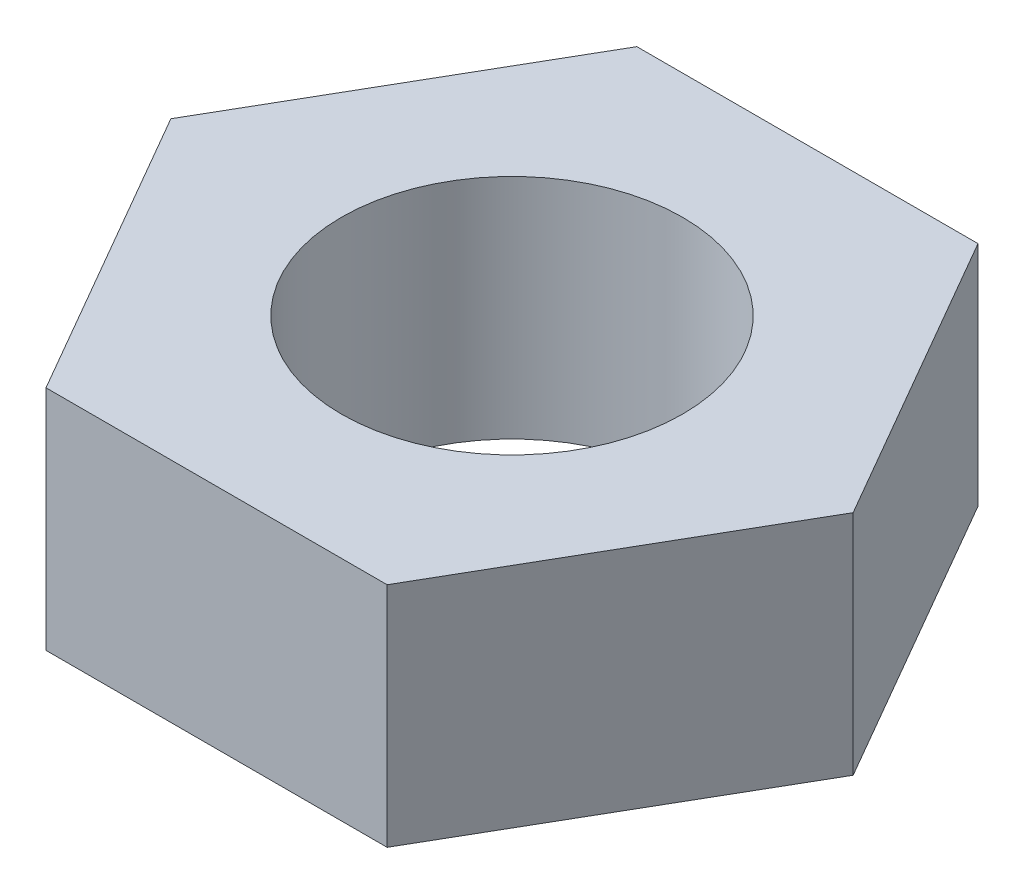
ISO-10303-21;
HEADER;
FILE_DESCRIPTION(('STEP AP214'),'2;1');
FILE_NAME('part.step','',(''),(''),'','','');
FILE_SCHEMA(('AUTOMOTIVE_DESIGN { 1 0 10303 214 1 1 1 1 }'));
ENDSEC;
DATA;
#1=APPLICATION_CONTEXT('core data for automotive mechanical design processes');
#2=APPLICATION_PROTOCOL_DEFINITION('international standard','automotive_design',2000,#1);
#3=PRODUCT_CONTEXT('',#1,'mechanical');
#4=PRODUCT('Part','Part','',(#3));
#5=PRODUCT_RELATED_PRODUCT_CATEGORY('part','',(#4));
#6=PRODUCT_DEFINITION_FORMATION('','',#4);
#7=PRODUCT_DEFINITION_CONTEXT('part definition',#1,'design');
#8=PRODUCT_DEFINITION('design','',#6,#7);
#9=PRODUCT_DEFINITION_SHAPE('','',#8);
#10=(LENGTH_UNIT() NAMED_UNIT(*) SI_UNIT(.MILLI.,.METRE.));
#11=(NAMED_UNIT(*) PLANE_ANGLE_UNIT() SI_UNIT($,.RADIAN.));
#12=(NAMED_UNIT(*) SI_UNIT($,.STERADIAN.) SOLID_ANGLE_UNIT());
#13=UNCERTAINTY_MEASURE_WITH_UNIT(LENGTH_MEASURE(1.E-05),#10,'distance_accuracy_value','');
#14=(GEOMETRIC_REPRESENTATION_CONTEXT(3) GLOBAL_UNCERTAINTY_ASSIGNED_CONTEXT((#13)) GLOBAL_UNIT_ASSIGNED_CONTEXT((#10,
#11,#12)) REPRESENTATION_CONTEXT('',''));
#15=CARTESIAN_POINT('',(0.,0.,0.));
#16=DIRECTION('',(0.,0.,1.));
#17=DIRECTION('',(1.,0.,0.));
#18=AXIS2_PLACEMENT_3D('',#15,#16,#17);
#19=CARTESIAN_POINT('',(0.,2.,0.));
#20=DIRECTION('',(0.,-1.,0.));
#21=DIRECTION('',(0.,0.,-1.));
#22=AXIS2_PLACEMENT_3D('',#19,#20,#21);
#23=PLANE('',#22);
#24=DIRECTION('',(0.499999999999998,0.,0.86602540378444));
#25=VECTOR('',#24,1.);
#26=CARTESIAN_POINT('',(-1.5,2.,2.59807621135332));
#27=LINE('',#26,#25);
#28=CARTESIAN_POINT('',(-2.99999999999999,2.,0.));
#29=VERTEX_POINT('',#28);
#30=CARTESIAN_POINT('',(-1.5,2.,2.59807621135332));
#31=VERTEX_POINT('',#30);
#32=EDGE_CURVE('E129',#29,#31,#27,.T.);
#33=ORIENTED_EDGE('',*,*,#32,.T.);
#34=DIRECTION('',(1.,0.,0.));
#35=VECTOR('',#34,1.);
#36=CARTESIAN_POINT('',(1.5,2.,2.59807621135332));
#37=LINE('',#36,#35);
#38=CARTESIAN_POINT('',(1.5,2.,2.59807621135332));
#39=VERTEX_POINT('',#38);
#40=EDGE_CURVE('E87',#31,#39,#37,.T.);
#41=ORIENTED_EDGE('',*,*,#40,.T.);
#42=DIRECTION('',(0.499999999999998,0.,-0.86602540378444));
#43=VECTOR('',#42,1.);
#44=CARTESIAN_POINT('',(2.99999999999999,2.,0.));
#45=LINE('',#44,#43);
#46=CARTESIAN_POINT('',(2.99999999999999,2.,0.));
#47=VERTEX_POINT('',#46);
#48=EDGE_CURVE('E100',#39,#47,#45,.T.);
#49=ORIENTED_EDGE('',*,*,#48,.T.);
#50=DIRECTION('',(-0.499999999999998,0.,-0.86602540378444));
#51=VECTOR('',#50,1.);
#52=CARTESIAN_POINT('',(1.5,2.,-2.59807621135332));
#53=LINE('',#52,#51);
#54=CARTESIAN_POINT('',(1.5,2.,-2.59807621135332));
#55=VERTEX_POINT('',#54);
#56=EDGE_CURVE('E94',#47,#55,#53,.T.);
#57=ORIENTED_EDGE('',*,*,#56,.T.);
#58=DIRECTION('',(-1.,0.,0.));
#59=VECTOR('',#58,1.);
#60=CARTESIAN_POINT('',(-1.5,2.,-2.59807621135332));
#61=LINE('',#60,#59);
#62=CARTESIAN_POINT('',(-1.5,2.,-2.59807621135332));
#63=VERTEX_POINT('',#62);
#64=EDGE_CURVE('E98',#55,#63,#61,.T.);
#65=ORIENTED_EDGE('',*,*,#64,.T.);
#66=DIRECTION('',(-0.499999999999998,0.,0.86602540378444));
#67=VECTOR('',#66,1.);
#68=CARTESIAN_POINT('',(-2.99999999999999,2.,0.));
#69=LINE('',#68,#67);
#70=EDGE_CURVE('E50',#63,#29,#69,.T.);
#71=ORIENTED_EDGE('',*,*,#70,.T.);
#72=EDGE_LOOP('',(#33,#41,#49,#57,#65,#71));
#73=FACE_BOUND('',#72,.T.);
#74=CARTESIAN_POINT('',(0.,2.,0.));
#75=DIRECTION('',(0.,1.,0.));
#76=DIRECTION('',(0.,0.,1.));
#77=AXIS2_PLACEMENT_3D('',#74,#75,#76);
#78=CIRCLE('',#77,1.5);
#79=CARTESIAN_POINT('',(0.,2.,1.5));
#80=VERTEX_POINT('',#79);
#81=EDGE_CURVE('E122',#80,#80,#78,.T.);
#82=ORIENTED_EDGE('',*,*,#81,.F.);
#83=EDGE_LOOP('',(#82));
#84=FACE_BOUND('',#83,.T.);
#85=ADVANCED_FACE('F33',(#73,#84),#23,.F.);
#86=CARTESIAN_POINT('',(0.,0.,0.));
#87=DIRECTION('',(0.,-1.,0.));
#88=DIRECTION('',(0.,0.,-1.));
#89=AXIS2_PLACEMENT_3D('',#86,#87,#88);
#90=PLANE('',#89);
#91=DIRECTION('',(0.499999999999998,0.,0.86602540378444));
#92=VECTOR('',#91,1.);
#93=CARTESIAN_POINT('',(-1.5,0.,2.59807621135332));
#94=LINE('',#93,#92);
#95=CARTESIAN_POINT('',(-2.99999999999999,0.,0.));
#96=VERTEX_POINT('',#95);
#97=CARTESIAN_POINT('',(-1.5,0.,2.59807621135332));
#98=VERTEX_POINT('',#97);
#99=EDGE_CURVE('E118',#96,#98,#94,.T.);
#100=ORIENTED_EDGE('',*,*,#99,.F.);
#101=DIRECTION('',(-0.499999999999998,0.,0.86602540378444));
#102=VECTOR('',#101,1.);
#103=CARTESIAN_POINT('',(-2.99999999999999,0.,0.));
#104=LINE('',#103,#102);
#105=CARTESIAN_POINT('',(-1.5,0.,-2.59807621135332));
#106=VERTEX_POINT('',#105);
#107=EDGE_CURVE('E79',#106,#96,#104,.T.);
#108=ORIENTED_EDGE('',*,*,#107,.F.);
#109=DIRECTION('',(-1.,0.,0.));
#110=VECTOR('',#109,1.);
#111=CARTESIAN_POINT('',(-1.5,0.,-2.59807621135332));
#112=LINE('',#111,#110);
#113=CARTESIAN_POINT('',(1.5,0.,-2.59807621135332));
#114=VERTEX_POINT('',#113);
#115=EDGE_CURVE('E73',#114,#106,#112,.T.);
#116=ORIENTED_EDGE('',*,*,#115,.F.);
#117=DIRECTION('',(-0.499999999999998,0.,-0.86602540378444));
#118=VECTOR('',#117,1.);
#119=CARTESIAN_POINT('',(1.5,0.,-2.59807621135332));
#120=LINE('',#119,#118);
#121=CARTESIAN_POINT('',(2.99999999999999,0.,0.));
#122=VERTEX_POINT('',#121);
#123=EDGE_CURVE('E108',#122,#114,#120,.T.);
#124=ORIENTED_EDGE('',*,*,#123,.F.);
#125=DIRECTION('',(0.499999999999998,0.,-0.86602540378444));
#126=VECTOR('',#125,1.);
#127=CARTESIAN_POINT('',(2.99999999999999,0.,0.));
#128=LINE('',#127,#126);
#129=CARTESIAN_POINT('',(1.5,0.,2.59807621135332));
#130=VERTEX_POINT('',#129);
#131=EDGE_CURVE('E124',#130,#122,#128,.T.);
#132=ORIENTED_EDGE('',*,*,#131,.F.);
#133=DIRECTION('',(1.,0.,0.));
#134=VECTOR('',#133,1.);
#135=CARTESIAN_POINT('',(1.5,0.,2.59807621135332));
#136=LINE('',#135,#134);
#137=EDGE_CURVE('E121',#98,#130,#136,.T.);
#138=ORIENTED_EDGE('',*,*,#137,.F.);
#139=EDGE_LOOP('',(#100,#108,#116,#124,#132,#138));
#140=FACE_BOUND('',#139,.T.);
#141=CARTESIAN_POINT('',(0.,0.,0.));
#142=DIRECTION('',(0.,1.,0.));
#143=DIRECTION('',(0.,0.,1.));
#144=AXIS2_PLACEMENT_3D('',#141,#142,#143);
#145=CIRCLE('',#144,1.5);
#146=CARTESIAN_POINT('',(0.,0.,1.5));
#147=VERTEX_POINT('',#146);
#148=EDGE_CURVE('E222',#147,#147,#145,.T.);
#149=ORIENTED_EDGE('',*,*,#148,.T.);
#150=EDGE_LOOP('',(#149));
#151=FACE_BOUND('',#150,.T.);
#152=ADVANCED_FACE('F138',(#140,#151),#90,.T.);
#153=CARTESIAN_POINT('',(-1.5,2.,2.59807621135332));
#154=DIRECTION('',(0.86602540378444,0.,-0.499999999999998));
#155=DIRECTION('',(-0.499999999999998,0.,-0.86602540378444));
#156=AXIS2_PLACEMENT_3D('',#153,#154,#155);
#157=PLANE('',#156);
#158=ORIENTED_EDGE('',*,*,#99,.T.);
#159=DIRECTION('',(0.,-1.,0.));
#160=VECTOR('',#159,1.);
#161=CARTESIAN_POINT('',(-1.5,2.,2.59807621135332));
#162=LINE('',#161,#160);
#163=EDGE_CURVE('E11',#31,#98,#162,.T.);
#164=ORIENTED_EDGE('',*,*,#163,.F.);
#165=ORIENTED_EDGE('',*,*,#32,.F.);
#166=DIRECTION('',(0.,-1.,0.));
#167=VECTOR('',#166,1.);
#168=CARTESIAN_POINT('',(-2.99999999999999,2.,0.));
#169=LINE('',#168,#167);
#170=EDGE_CURVE('E114',#29,#96,#169,.T.);
#171=ORIENTED_EDGE('',*,*,#170,.T.);
#172=EDGE_LOOP('',(#158,#164,#165,#171));
#173=FACE_BOUND('',#172,.T.);
#174=ADVANCED_FACE('F35',(#173),#157,.F.);
#175=CARTESIAN_POINT('',(1.5,2.,2.59807621135332));
#176=DIRECTION('',(0.,0.,-1.));
#177=DIRECTION('',(-1.,0.,0.));
#178=AXIS2_PLACEMENT_3D('',#175,#176,#177);
#179=PLANE('',#178);
#180=ORIENTED_EDGE('',*,*,#137,.T.);
#181=DIRECTION('',(0.,-1.,0.));
#182=VECTOR('',#181,1.);
#183=CARTESIAN_POINT('',(1.5,2.,2.59807621135332));
#184=LINE('',#183,#182);
#185=EDGE_CURVE('E42',#39,#130,#184,.T.);
#186=ORIENTED_EDGE('',*,*,#185,.F.);
#187=ORIENTED_EDGE('',*,*,#40,.F.);
#188=ORIENTED_EDGE('',*,*,#163,.T.);
#189=EDGE_LOOP('',(#180,#186,#187,#188));
#190=FACE_BOUND('',#189,.T.);
#191=ADVANCED_FACE('F163',(#190),#179,.F.);
#192=CARTESIAN_POINT('',(2.99999999999999,2.,0.));
#193=DIRECTION('',(-0.86602540378444,0.,-0.499999999999998));
#194=DIRECTION('',(-0.499999999999998,0.,0.86602540378444));
#195=AXIS2_PLACEMENT_3D('',#192,#193,#194);
#196=PLANE('',#195);
#197=ORIENTED_EDGE('',*,*,#131,.T.);
#198=DIRECTION('',(0.,-1.,0.));
#199=VECTOR('',#198,1.);
#200=CARTESIAN_POINT('',(2.99999999999999,2.,0.));
#201=LINE('',#200,#199);
#202=EDGE_CURVE('E109',#47,#122,#201,.T.);
#203=ORIENTED_EDGE('',*,*,#202,.F.);
#204=ORIENTED_EDGE('',*,*,#48,.F.);
#205=ORIENTED_EDGE('',*,*,#185,.T.);
#206=EDGE_LOOP('',(#197,#203,#204,#205));
#207=FACE_BOUND('',#206,.T.);
#208=ADVANCED_FACE('F135',(#207),#196,.F.);
#209=CARTESIAN_POINT('',(1.5,2.,-2.59807621135332));
#210=DIRECTION('',(-0.86602540378444,0.,0.499999999999998));
#211=DIRECTION('',(0.499999999999998,0.,0.86602540378444));
#212=AXIS2_PLACEMENT_3D('',#209,#210,#211);
#213=PLANE('',#212);
#214=ORIENTED_EDGE('',*,*,#123,.T.);
#215=DIRECTION('',(0.,-1.,0.));
#216=VECTOR('',#215,1.);
#217=CARTESIAN_POINT('',(1.5,2.,-2.59807621135332));
#218=LINE('',#217,#216);
#219=EDGE_CURVE('E105',#55,#114,#218,.T.);
#220=ORIENTED_EDGE('',*,*,#219,.F.);
#221=ORIENTED_EDGE('',*,*,#56,.F.);
#222=ORIENTED_EDGE('',*,*,#202,.T.);
#223=EDGE_LOOP('',(#214,#220,#221,#222));
#224=FACE_BOUND('',#223,.T.);
#225=ADVANCED_FACE('F106',(#224),#213,.F.);
#226=CARTESIAN_POINT('',(-1.5,2.,-2.59807621135332));
#227=DIRECTION('',(0.,0.,1.));
#228=DIRECTION('',(1.,0.,0.));
#229=AXIS2_PLACEMENT_3D('',#226,#227,#228);
#230=PLANE('',#229);
#231=ORIENTED_EDGE('',*,*,#115,.T.);
#232=DIRECTION('',(0.,-1.,0.));
#233=VECTOR('',#232,1.);
#234=CARTESIAN_POINT('',(-1.5,2.,-2.59807621135332));
#235=LINE('',#234,#233);
#236=EDGE_CURVE('E110',#63,#106,#235,.T.);
#237=ORIENTED_EDGE('',*,*,#236,.F.);
#238=ORIENTED_EDGE('',*,*,#64,.F.);
#239=ORIENTED_EDGE('',*,*,#219,.T.);
#240=EDGE_LOOP('',(#231,#237,#238,#239));
#241=FACE_BOUND('',#240,.T.);
#242=ADVANCED_FACE('F112',(#241),#230,.F.);
#243=CARTESIAN_POINT('',(-2.99999999999999,2.,0.));
#244=DIRECTION('',(0.86602540378444,0.,0.499999999999998));
#245=DIRECTION('',(0.499999999999998,0.,-0.86602540378444));
#246=AXIS2_PLACEMENT_3D('',#243,#244,#245);
#247=PLANE('',#246);
#248=ORIENTED_EDGE('',*,*,#107,.T.);
#249=ORIENTED_EDGE('',*,*,#170,.F.);
#250=ORIENTED_EDGE('',*,*,#70,.F.);
#251=ORIENTED_EDGE('',*,*,#236,.T.);
#252=EDGE_LOOP('',(#248,#249,#250,#251));
#253=FACE_BOUND('',#252,.T.);
#254=ADVANCED_FACE('F143',(#253),#247,.F.);
#255=CARTESIAN_POINT('',(0.,2.,0.));
#256=DIRECTION('',(0.,-1.,0.));
#257=DIRECTION('',(0.,0.,-1.));
#258=AXIS2_PLACEMENT_3D('',#255,#256,#257);
#259=CYLINDRICAL_SURFACE('',#258,1.5);
#260=ORIENTED_EDGE('',*,*,#81,.T.);
#261=EDGE_LOOP('',(#260));
#262=FACE_BOUND('',#261,.T.);
#263=ORIENTED_EDGE('',*,*,#148,.F.);
#264=EDGE_LOOP('',(#263));
#265=FACE_BOUND('',#264,.T.);
#266=ADVANCED_FACE('F145',(#262,#265),#259,.F.);
#267=CLOSED_SHELL('',(#85,#152,#174,#191,#208,#225,#242,#254,#266));
#268=MANIFOLD_SOLID_BREP('B2',#267);
#269=ADVANCED_BREP_SHAPE_REPRESENTATION('',(#18,#268),#14);
#270=SHAPE_DEFINITION_REPRESENTATION(#9,#269);
ENDSEC;
END-ISO-10303-21;
